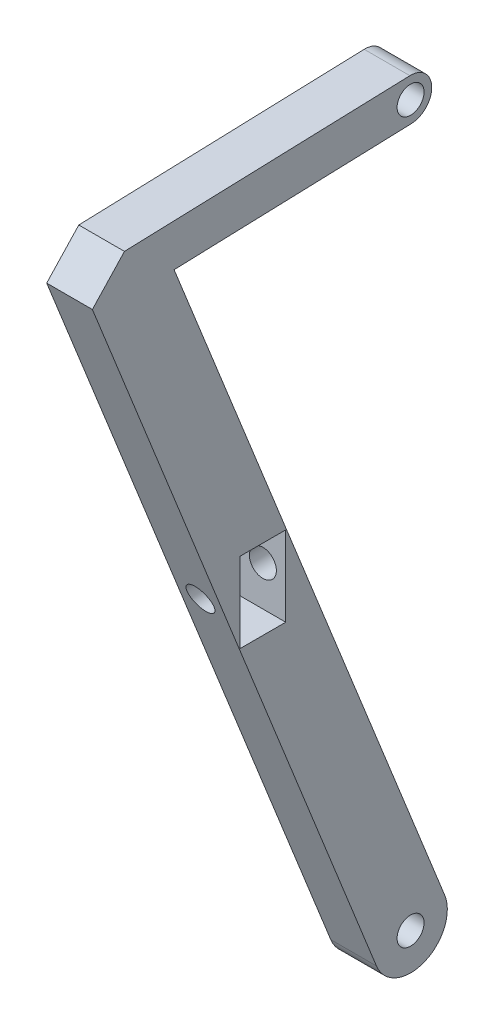
ISO-10303-21;
HEADER;
FILE_DESCRIPTION(('STEP AP214'),'2;1');
FILE_NAME('part.step','',(''),(''),'','','');
FILE_SCHEMA(('AUTOMOTIVE_DESIGN { 1 0 10303 214 1 1 1 1 }'));
ENDSEC;
DATA;
#1=APPLICATION_CONTEXT('core data for automotive mechanical design processes');
#2=APPLICATION_PROTOCOL_DEFINITION('international standard','automotive_design',2000,#1);
#3=PRODUCT_CONTEXT('',#1,'mechanical');
#4=PRODUCT('Part','Part','',(#3));
#5=PRODUCT_RELATED_PRODUCT_CATEGORY('part','',(#4));
#6=PRODUCT_DEFINITION_FORMATION('','',#4);
#7=PRODUCT_DEFINITION_CONTEXT('part definition',#1,'design');
#8=PRODUCT_DEFINITION('design','',#6,#7);
#9=PRODUCT_DEFINITION_SHAPE('','',#8);
#10=(LENGTH_UNIT() NAMED_UNIT(*) SI_UNIT(.MILLI.,.METRE.));
#11=(NAMED_UNIT(*) PLANE_ANGLE_UNIT() SI_UNIT($,.RADIAN.));
#12=(NAMED_UNIT(*) SI_UNIT($,.STERADIAN.) SOLID_ANGLE_UNIT());
#13=UNCERTAINTY_MEASURE_WITH_UNIT(LENGTH_MEASURE(1.E-05),#10,'distance_accuracy_value','');
#14=(GEOMETRIC_REPRESENTATION_CONTEXT(3) GLOBAL_UNCERTAINTY_ASSIGNED_CONTEXT((#13)) GLOBAL_UNIT_ASSIGNED_CONTEXT((#10,
#11,#12)) REPRESENTATION_CONTEXT('',''));
#15=CARTESIAN_POINT('',(0.,0.,0.));
#16=DIRECTION('',(0.,0.,1.));
#17=DIRECTION('',(1.,0.,0.));
#18=AXIS2_PLACEMENT_3D('',#15,#16,#17);
#19=CARTESIAN_POINT('',(2.54,1.51629735101285,-3.79292461153072));
#20=DIRECTION('',(0.,-0.371206534410744,0.928550326482504));
#21=DIRECTION('',(0.,-0.928550326482504,-0.371206534410744));
#22=AXIS2_PLACEMENT_3D('',#19,#20,#21);
#23=PLANE('',#22);
#24=CARTESIAN_POINT('',(0.,41.075962298,12.021841382952));
#25=DIRECTION('',(0.,-0.371206534410744,0.928550326482504));
#26=DIRECTION('',(0.,0.928550326482504,0.371206534410744));
#27=AXIS2_PLACEMENT_3D('',#24,#25,#26);
#28=ELLIPSE('',#27,1.61542132636175,1.5);
#29=CARTESIAN_POINT('',(0.,42.575962298,12.6214963351239));
#30=VERTEX_POINT('',#29);
#31=EDGE_CURVE('E159',#30,#30,#28,.T.);
#32=ORIENTED_EDGE('',*,*,#31,.T.);
#33=EDGE_LOOP('',(#32));
#34=FACE_BOUND('',#33,.T.);
#35=DIRECTION('',(0.,0.928550326482504,0.371206534410744));
#36=VECTOR('',#35,1.);
#37=CARTESIAN_POINT('',(-2.54,1.51629735101285,-3.79292461153072));
#38=LINE('',#37,#36);
#39=CARTESIAN_POINT('',(-2.54,1.51629735101285,-3.79292461153072));
#40=VERTEX_POINT('',#39);
#41=CARTESIAN_POINT('',(-2.54,76.7745550239051,26.2930666587244));
#42=VERTEX_POINT('',#41);
#43=EDGE_CURVE('E209',#40,#42,#38,.T.);
#44=ORIENTED_EDGE('',*,*,#43,.T.);
#45=DIRECTION('',(-1.,0.,0.));
#46=VECTOR('',#45,1.);
#47=CARTESIAN_POINT('',(2.54,76.7745550239051,26.2930666587244));
#48=LINE('',#47,#46);
#49=CARTESIAN_POINT('',(2.54,76.7745550239051,26.2930666587244));
#50=VERTEX_POINT('',#49);
#51=EDGE_CURVE('E11',#50,#42,#48,.T.);
#52=ORIENTED_EDGE('',*,*,#51,.F.);
#53=DIRECTION('',(0.,0.928550326482504,0.371206534410744));
#54=VECTOR('',#53,1.);
#55=CARTESIAN_POINT('',(2.54,1.51629735101285,-3.79292461153072));
#56=LINE('',#55,#54);
#57=CARTESIAN_POINT('',(2.54,1.51629735101285,-3.79292461153072));
#58=VERTEX_POINT('',#57);
#59=EDGE_CURVE('E178',#58,#50,#56,.T.);
#60=ORIENTED_EDGE('',*,*,#59,.F.);
#61=DIRECTION('',(-1.,0.,0.));
#62=VECTOR('',#61,1.);
#63=CARTESIAN_POINT('',(2.54,1.51629735101285,-3.79292461153072));
#64=LINE('',#63,#62);
#65=EDGE_CURVE('E206',#58,#40,#64,.T.);
#66=ORIENTED_EDGE('',*,*,#65,.T.);
#67=EDGE_LOOP('',(#44,#52,#60,#66));
#68=FACE_BOUND('',#67,.T.);
#69=ADVANCED_FACE('F39',(#34,#68),#23,.F.);
#70=CARTESIAN_POINT('',(2.54,77.5603537697931,2.56898588881145));
#71=DIRECTION('',(0.,0.999451903899437,0.0331042563999157));
#72=DIRECTION('',(0.,-0.0331042563999157,0.999451903899437));
#73=AXIS2_PLACEMENT_3D('',#70,#71,#72);
#74=PLANE('',#73);
#75=DIRECTION('',(0.,0.0331042563999157,-0.999451903899437));
#76=VECTOR('',#75,1.);
#77=CARTESIAN_POINT('',(-2.54,77.5603537697931,2.56898588881145));
#78=LINE('',#77,#76);
#79=CARTESIAN_POINT('',(-2.54,77.6454447753924,0.));
#80=VERTEX_POINT('',#79);
#81=EDGE_CURVE('E212',#42,#80,#78,.T.);
#82=ORIENTED_EDGE('',*,*,#81,.T.);
#83=DIRECTION('',(-1.,0.,0.));
#84=VECTOR('',#83,1.);
#85=CARTESIAN_POINT('',(2.54,77.6454447753924,0.));
#86=LINE('',#85,#84);
#87=CARTESIAN_POINT('',(2.54,77.6454447753924,0.));
#88=VERTEX_POINT('',#87);
#89=EDGE_CURVE('E48',#88,#80,#86,.T.);
#90=ORIENTED_EDGE('',*,*,#89,.F.);
#91=DIRECTION('',(0.,0.0331042563999157,-0.999451903899437));
#92=VECTOR('',#91,1.);
#93=CARTESIAN_POINT('',(2.54,77.5603537697931,2.56898588881145));
#94=LINE('',#93,#92);
#95=EDGE_CURVE('E182',#50,#88,#94,.T.);
#96=ORIENTED_EDGE('',*,*,#95,.F.);
#97=ORIENTED_EDGE('',*,*,#51,.T.);
#98=EDGE_LOOP('',(#82,#90,#96,#97));
#99=FACE_BOUND('',#98,.T.);
#100=ADVANCED_FACE('F275',(#99),#74,.F.);
#101=CARTESIAN_POINT('',(2.54,0.,0.));
#102=DIRECTION('',(0.,0.,1.));
#103=DIRECTION('',(0.,-1.,0.));
#104=AXIS2_PLACEMENT_3D('',#101,#102,#103);
#105=PLANE('',#104);
#106=DIRECTION('',(0.,1.,0.));
#107=VECTOR('',#106,1.);
#108=CARTESIAN_POINT('',(-2.54,0.,0.));
#109=LINE('',#108,#107);
#110=CARTESIAN_POINT('',(-2.54,77.6572407742781,0.));
#111=VERTEX_POINT('',#110);
#112=EDGE_CURVE('E214',#80,#111,#109,.T.);
#113=ORIENTED_EDGE('',*,*,#112,.T.);
#114=DIRECTION('',(-1.,0.,0.));
#115=VECTOR('',#114,1.);
#116=CARTESIAN_POINT('',(2.54,77.6572407742781,0.));
#117=LINE('',#116,#115);
#118=CARTESIAN_POINT('',(2.54,77.6572407742781,0.));
#119=VERTEX_POINT('',#118);
#120=EDGE_CURVE('E247',#119,#111,#117,.T.);
#121=ORIENTED_EDGE('',*,*,#120,.F.);
#122=DIRECTION('',(0.,1.,0.));
#123=VECTOR('',#122,1.);
#124=CARTESIAN_POINT('',(2.54,0.,0.));
#125=LINE('',#124,#123);
#126=EDGE_CURVE('E184',#88,#119,#125,.T.);
#127=ORIENTED_EDGE('',*,*,#126,.F.);
#128=ORIENTED_EDGE('',*,*,#89,.T.);
#129=EDGE_LOOP('',(#113,#121,#127,#128));
#130=FACE_BOUND('',#129,.T.);
#131=ADVANCED_FACE('F255',(#130),#105,.F.);
#132=CARTESIAN_POINT('',(2.54,76.5854986423084,-9.05979611210233));
#133=DIRECTION('',(0.,0.993075561150244,-0.117477358865984));
#134=DIRECTION('',(0.,0.117477358865984,0.993075561150244));
#135=AXIS2_PLACEMENT_3D('',#132,#133,#134);
#136=PLANE('',#135);
#137=DIRECTION('',(0.,-0.117477358865984,-0.993075561150245));
#138=VECTOR('',#137,1.);
#139=CARTESIAN_POINT('',(-2.54,76.5854986423084,-9.05979611210233));
#140=LINE('',#139,#138);
#141=CARTESIAN_POINT('',(-2.54,77.6480251131364,-0.0779030780741915));
#142=VERTEX_POINT('',#141);
#143=EDGE_CURVE('E216',#111,#142,#140,.T.);
#144=ORIENTED_EDGE('',*,*,#143,.T.);
#145=DIRECTION('',(-1.,0.,0.));
#146=VECTOR('',#145,1.);
#147=CARTESIAN_POINT('',(2.54,77.6480251131364,-0.0779030780741915));
#148=LINE('',#147,#146);
#149=CARTESIAN_POINT('',(2.54,77.6480251131364,-0.0779030780741915));
#150=VERTEX_POINT('',#149);
#151=EDGE_CURVE('E245',#150,#142,#148,.T.);
#152=ORIENTED_EDGE('',*,*,#151,.F.);
#153=DIRECTION('',(0.,-0.117477358865984,-0.993075561150245));
#154=VECTOR('',#153,1.);
#155=CARTESIAN_POINT('',(2.54,76.5854986423084,-9.05979611210233));
#156=LINE('',#155,#154);
#157=EDGE_CURVE('E186',#119,#150,#156,.T.);
#158=ORIENTED_EDGE('',*,*,#157,.F.);
#159=ORIENTED_EDGE('',*,*,#120,.T.);
#160=EDGE_LOOP('',(#144,#152,#158,#159));
#161=FACE_BOUND('',#160,.T.);
#162=ADVANCED_FACE('F265',(#161),#136,.F.);
#163=CARTESIAN_POINT('',(2.54,80.,0.));
#164=DIRECTION('',(-1.,0.,0.));
#165=DIRECTION('',(0.,0.,1.));
#166=AXIS2_PLACEMENT_3D('',#163,#164,#165);
#167=CYLINDRICAL_SURFACE('',#166,2.35326470207046);
#168=CARTESIAN_POINT('',(-2.54,80.,0.));
#169=DIRECTION('',(1.,0.,0.));
#170=DIRECTION('',(0.,0.,-1.));
#171=AXIS2_PLACEMENT_3D('',#168,#169,#170);
#172=CIRCLE('',#171,2.35326470207046);
#173=CARTESIAN_POINT('',(-2.54,82.3519748868637,0.0779030780742322));
#174=VERTEX_POINT('',#173);
#175=EDGE_CURVE('E219',#174,#142,#172,.F.);
#176=ORIENTED_EDGE('',*,*,#175,.F.);
#177=DIRECTION('',(-1.,0.,0.));
#178=VECTOR('',#177,1.);
#179=CARTESIAN_POINT('',(2.54,82.3519748868637,0.0779030780742322));
#180=LINE('',#179,#178);
#181=CARTESIAN_POINT('',(2.54,82.3519748868637,0.0779030780742322));
#182=VERTEX_POINT('',#181);
#183=EDGE_CURVE('E243',#182,#174,#180,.T.);
#184=ORIENTED_EDGE('',*,*,#183,.F.);
#185=CARTESIAN_POINT('',(2.54,80.,0.));
#186=DIRECTION('',(1.,0.,0.));
#187=DIRECTION('',(0.,0.,-1.));
#188=AXIS2_PLACEMENT_3D('',#185,#186,#187);
#189=CIRCLE('',#188,2.35326470207046);
#190=EDGE_CURVE('E188',#182,#150,#189,.F.);
#191=ORIENTED_EDGE('',*,*,#190,.T.);
#192=ORIENTED_EDGE('',*,*,#151,.T.);
#193=EDGE_LOOP('',(#176,#184,#191,#192));
#194=FACE_BOUND('',#193,.T.);
#195=ADVANCED_FACE('F292',(#194),#167,.T.);
#196=CARTESIAN_POINT('',(2.54,82.2643035435204,2.72479204495989));
#197=DIRECTION('',(0.,0.999451903899437,0.0331042563999158));
#198=DIRECTION('',(0.,-0.0331042563999158,0.999451903899437));
#199=AXIS2_PLACEMENT_3D('',#196,#197,#198);
#200=PLANE('',#199);
#201=DIRECTION('',(0.,0.0331042563999158,-0.999451903899437));
#202=VECTOR('',#201,1.);
#203=CARTESIAN_POINT('',(-2.54,82.2643035435204,2.72479204495989));
#204=LINE('',#203,#202);
#205=CARTESIAN_POINT('',(-2.54,81.3009147461663,31.8105010268816));
#206=VERTEX_POINT('',#205);
#207=EDGE_CURVE('E222',#206,#174,#204,.T.);
#208=ORIENTED_EDGE('',*,*,#207,.F.);
#209=DIRECTION('',(-1.,0.,0.));
#210=VECTOR('',#209,1.);
#211=CARTESIAN_POINT('',(2.54,81.3009147461663,31.8105010268816));
#212=LINE('',#211,#210);
#213=CARTESIAN_POINT('',(2.54,81.3009147461663,31.8105010268816));
#214=VERTEX_POINT('',#213);
#215=EDGE_CURVE('E241',#214,#206,#212,.T.);
#216=ORIENTED_EDGE('',*,*,#215,.F.);
#217=DIRECTION('',(0.,0.0331042563999158,-0.999451903899437));
#218=VECTOR('',#217,1.);
#219=CARTESIAN_POINT('',(2.54,82.2643035435204,2.72479204495989));
#220=LINE('',#219,#218);
#221=EDGE_CURVE('E191',#214,#182,#220,.T.);
#222=ORIENTED_EDGE('',*,*,#221,.T.);
#223=ORIENTED_EDGE('',*,*,#183,.T.);
#224=EDGE_LOOP('',(#208,#216,#222,#223));
#225=FACE_BOUND('',#224,.T.);
#226=ADVANCED_FACE('F290',(#225),#200,.T.);
#227=CARTESIAN_POINT('',(2.54,53.8590029402488,57.5101901545011));
#228=DIRECTION('',(0.,0.683557360271013,0.729896797649725));
#229=DIRECTION('',(0.,-0.729896797649725,0.683557360271013));
#230=AXIS2_PLACEMENT_3D('',#227,#228,#229);
#231=PLANE('',#230);
#232=DIRECTION('',(0.,0.729896797649725,-0.683557360271013));
#233=VECTOR('',#232,1.);
#234=CARTESIAN_POINT('',(-2.54,53.8590029402488,57.5101901545011));
#235=LINE('',#234,#233);
#236=CARTESIAN_POINT('',(-2.54,77.4916464643599,35.3779277914051));
#237=VERTEX_POINT('',#236);
#238=EDGE_CURVE('E225',#237,#206,#235,.T.);
#239=ORIENTED_EDGE('',*,*,#238,.F.);
#240=DIRECTION('',(-1.,0.,0.));
#241=VECTOR('',#240,1.);
#242=CARTESIAN_POINT('',(2.54,77.4916464643599,35.3779277914051));
#243=LINE('',#242,#241);
#244=CARTESIAN_POINT('',(2.54,77.4916464643599,35.3779277914051));
#245=VERTEX_POINT('',#244);
#246=EDGE_CURVE('E239',#245,#237,#243,.T.);
#247=ORIENTED_EDGE('',*,*,#246,.F.);
#248=DIRECTION('',(0.,0.729896797649725,-0.683557360271013));
#249=VECTOR('',#248,1.);
#250=CARTESIAN_POINT('',(2.54,53.8590029402488,57.5101901545011));
#251=LINE('',#250,#249);
#252=EDGE_CURVE('E194',#245,#214,#251,.T.);
#253=ORIENTED_EDGE('',*,*,#252,.T.);
#254=ORIENTED_EDGE('',*,*,#215,.T.);
#255=EDGE_LOOP('',(#239,#247,#253,#254));
#256=FACE_BOUND('',#255,.T.);
#257=ADVANCED_FACE('F287',(#256),#231,.T.);
#258=CARTESIAN_POINT('',(2.54,-1.51629735101285,3.79292461153072));
#259=DIRECTION('',(0.,-0.371206534410744,0.928550326482504));
#260=DIRECTION('',(0.,-0.928550326482504,-0.371206534410744));
#261=AXIS2_PLACEMENT_3D('',#258,#259,#260);
#262=PLANE('',#261);
#263=CARTESIAN_POINT('',(0.,41.075962298,20.8200308933468));
#264=DIRECTION('',(0.,-0.371206534410744,0.928550326482504));
#265=DIRECTION('',(0.,0.928550326482504,0.371206534410744));
#266=AXIS2_PLACEMENT_3D('',#263,#264,#265);
#267=ELLIPSE('',#266,1.61542132636175,1.5);
#268=CARTESIAN_POINT('',(0.,42.575962298,21.4196858455188));
#269=VERTEX_POINT('',#268);
#270=EDGE_CURVE('E452',#269,#269,#267,.T.);
#271=ORIENTED_EDGE('',*,*,#270,.F.);
#272=EDGE_LOOP('',(#271));
#273=FACE_BOUND('',#272,.T.);
#274=DIRECTION('',(0.,0.928550326482504,0.371206534410744));
#275=VECTOR('',#274,1.);
#276=CARTESIAN_POINT('',(-2.54,-1.51629735101285,3.79292461153072));
#277=LINE('',#276,#275);
#278=CARTESIAN_POINT('',(-2.54,-1.51629735101285,3.79292461153072));
#279=VERTEX_POINT('',#278);
#280=EDGE_CURVE('E228',#279,#237,#277,.T.);
#281=ORIENTED_EDGE('',*,*,#280,.F.);
#282=DIRECTION('',(-1.,0.,0.));
#283=VECTOR('',#282,1.);
#284=CARTESIAN_POINT('',(2.54,-1.51629735101285,3.79292461153072));
#285=LINE('',#284,#283);
#286=CARTESIAN_POINT('',(2.54,-1.51629735101285,3.79292461153072));
#287=VERTEX_POINT('',#286);
#288=EDGE_CURVE('E237',#287,#279,#285,.T.);
#289=ORIENTED_EDGE('',*,*,#288,.F.);
#290=DIRECTION('',(0.,0.928550326482504,0.371206534410744));
#291=VECTOR('',#290,1.);
#292=CARTESIAN_POINT('',(2.54,-1.51629735101285,3.79292461153072));
#293=LINE('',#292,#291);
#294=EDGE_CURVE('E197',#287,#245,#293,.T.);
#295=ORIENTED_EDGE('',*,*,#294,.T.);
#296=ORIENTED_EDGE('',*,*,#246,.T.);
#297=EDGE_LOOP('',(#281,#289,#295,#296));
#298=FACE_BOUND('',#297,.T.);
#299=ADVANCED_FACE('F283',(#273,#298),#262,.T.);
#300=CARTESIAN_POINT('',(2.54,0.,0.));
#301=DIRECTION('',(-1.,0.,0.));
#302=DIRECTION('',(0.,0.,1.));
#303=AXIS2_PLACEMENT_3D('',#300,#301,#302);
#304=CYLINDRICAL_SURFACE('',#303,4.08478087116605);
#305=CARTESIAN_POINT('',(-2.54,0.,0.));
#306=DIRECTION('',(1.,0.,0.));
#307=DIRECTION('',(0.,0.,-1.));
#308=AXIS2_PLACEMENT_3D('',#305,#306,#307);
#309=CIRCLE('',#308,4.08478087116605);
#310=EDGE_CURVE('E231',#40,#279,#309,.F.);
#311=ORIENTED_EDGE('',*,*,#310,.F.);
#312=ORIENTED_EDGE('',*,*,#65,.F.);
#313=CARTESIAN_POINT('',(2.54,0.,0.));
#314=DIRECTION('',(1.,0.,0.));
#315=DIRECTION('',(0.,0.,-1.));
#316=AXIS2_PLACEMENT_3D('',#313,#314,#315);
#317=CIRCLE('',#316,4.08478087116605);
#318=EDGE_CURVE('E200',#58,#287,#317,.F.);
#319=ORIENTED_EDGE('',*,*,#318,.T.);
#320=ORIENTED_EDGE('',*,*,#288,.T.);
#321=EDGE_LOOP('',(#311,#312,#319,#320));
#322=FACE_BOUND('',#321,.T.);
#323=ADVANCED_FACE('F279',(#322),#304,.T.);
#324=CARTESIAN_POINT('',(2.54,80.,0.));
#325=DIRECTION('',(-1.,0.,0.));
#326=DIRECTION('',(0.,0.,1.));
#327=AXIS2_PLACEMENT_3D('',#324,#325,#326);
#328=CYLINDRICAL_SURFACE('',#327,1.5);
#329=CARTESIAN_POINT('',(2.54,80.,0.));
#330=DIRECTION('',(1.,0.,0.));
#331=DIRECTION('',(0.,0.,-1.));
#332=AXIS2_PLACEMENT_3D('',#329,#330,#331);
#333=CIRCLE('',#332,1.5);
#334=CARTESIAN_POINT('',(2.54,80.,-1.49999999999998));
#335=VERTEX_POINT('',#334);
#336=EDGE_CURVE('E175',#335,#335,#333,.T.);
#337=ORIENTED_EDGE('',*,*,#336,.T.);
#338=EDGE_LOOP('',(#337));
#339=FACE_BOUND('',#338,.T.);
#340=CARTESIAN_POINT('',(-2.54,80.,0.));
#341=DIRECTION('',(1.,0.,0.));
#342=DIRECTION('',(0.,0.,-1.));
#343=AXIS2_PLACEMENT_3D('',#340,#341,#342);
#344=CIRCLE('',#343,1.5);
#345=CARTESIAN_POINT('',(-2.54,80.,-1.49999999999998));
#346=VERTEX_POINT('',#345);
#347=EDGE_CURVE('E171',#346,#346,#344,.T.);
#348=ORIENTED_EDGE('',*,*,#347,.F.);
#349=EDGE_LOOP('',(#348));
#350=FACE_BOUND('',#349,.T.);
#351=ADVANCED_FACE('F41',(#339,#350),#328,.F.);
#352=CARTESIAN_POINT('',(2.54,0.,0.));
#353=DIRECTION('',(-1.,0.,0.));
#354=DIRECTION('',(0.,0.,1.));
#355=AXIS2_PLACEMENT_3D('',#352,#353,#354);
#356=CYLINDRICAL_SURFACE('',#355,1.5);
#357=CARTESIAN_POINT('',(2.54,0.,0.));
#358=DIRECTION('',(1.,0.,0.));
#359=DIRECTION('',(0.,0.,-1.));
#360=AXIS2_PLACEMENT_3D('',#357,#358,#359);
#361=CIRCLE('',#360,1.5);
#362=CARTESIAN_POINT('',(2.54,0.,-1.5));
#363=VERTEX_POINT('',#362);
#364=EDGE_CURVE('E203',#363,#363,#361,.T.);
#365=ORIENTED_EDGE('',*,*,#364,.T.);
#366=EDGE_LOOP('',(#365));
#367=FACE_BOUND('',#366,.T.);
#368=CARTESIAN_POINT('',(-2.54,0.,0.));
#369=DIRECTION('',(1.,0.,0.));
#370=DIRECTION('',(0.,0.,-1.));
#371=AXIS2_PLACEMENT_3D('',#368,#369,#370);
#372=CIRCLE('',#371,1.5);
#373=CARTESIAN_POINT('',(-2.54,0.,-1.5));
#374=VERTEX_POINT('',#373);
#375=EDGE_CURVE('E179',#374,#374,#372,.T.);
#376=ORIENTED_EDGE('',*,*,#375,.F.);
#377=EDGE_LOOP('',(#376));
#378=FACE_BOUND('',#377,.T.);
#379=ADVANCED_FACE('F366',(#367,#378),#356,.F.);
#380=CARTESIAN_POINT('',(2.54,0.,0.));
#381=DIRECTION('',(1.,0.,0.));
#382=DIRECTION('',(0.,0.,-1.));
#383=AXIS2_PLACEMENT_3D('',#380,#381,#382);
#384=PLANE('',#383);
#385=DIRECTION('',(0.,-1.,0.));
#386=VECTOR('',#385,1.);
#387=CARTESIAN_POINT('',(2.54,36.630962298,18.9609361381494));
#388=LINE('',#387,#386);
#389=CARTESIAN_POINT('',(2.54,45.520962298,18.9609361381494));
#390=VERTEX_POINT('',#389);
#391=CARTESIAN_POINT('',(2.54,36.630962298,18.9609361381494));
#392=VERTEX_POINT('',#391);
#393=EDGE_CURVE('E55',#390,#392,#388,.T.);
#394=ORIENTED_EDGE('',*,*,#393,.F.);
#395=DIRECTION('',(0.,0.,1.));
#396=VECTOR('',#395,1.);
#397=CARTESIAN_POINT('',(2.54,45.520962298,13.8809361381494));
#398=LINE('',#397,#396);
#399=CARTESIAN_POINT('',(2.54,45.520962298,13.8809361381494));
#400=VERTEX_POINT('',#399);
#401=EDGE_CURVE('E153',#400,#390,#398,.T.);
#402=ORIENTED_EDGE('',*,*,#401,.F.);
#403=DIRECTION('',(0.,1.,0.));
#404=VECTOR('',#403,1.);
#405=CARTESIAN_POINT('',(2.54,36.630962298,13.8809361381494));
#406=LINE('',#405,#404);
#407=CARTESIAN_POINT('',(2.54,36.630962298,13.8809361381494));
#408=VERTEX_POINT('',#407);
#409=EDGE_CURVE('E156',#408,#400,#406,.T.);
#410=ORIENTED_EDGE('',*,*,#409,.F.);
#411=DIRECTION('',(0.,0.,-1.));
#412=VECTOR('',#411,1.);
#413=CARTESIAN_POINT('',(2.54,36.630962298,13.8809361381494));
#414=LINE('',#413,#412);
#415=EDGE_CURVE('E165',#392,#408,#414,.T.);
#416=ORIENTED_EDGE('',*,*,#415,.F.);
#417=EDGE_LOOP('',(#394,#402,#410,#416));
#418=FACE_BOUND('',#417,.T.);
#419=ORIENTED_EDGE('',*,*,#336,.F.);
#420=EDGE_LOOP('',(#419));
#421=FACE_BOUND('',#420,.T.);
#422=ORIENTED_EDGE('',*,*,#59,.T.);
#423=ORIENTED_EDGE('',*,*,#95,.T.);
#424=ORIENTED_EDGE('',*,*,#126,.T.);
#425=ORIENTED_EDGE('',*,*,#157,.T.);
#426=ORIENTED_EDGE('',*,*,#190,.F.);
#427=ORIENTED_EDGE('',*,*,#221,.F.);
#428=ORIENTED_EDGE('',*,*,#252,.F.);
#429=ORIENTED_EDGE('',*,*,#294,.F.);
#430=ORIENTED_EDGE('',*,*,#318,.F.);
#431=EDGE_LOOP('',(#422,#423,#424,#425,#426,#427,#428,#429,#430));
#432=FACE_BOUND('',#431,.T.);
#433=ORIENTED_EDGE('',*,*,#364,.F.);
#434=EDGE_LOOP('',(#433));
#435=FACE_BOUND('',#434,.T.);
#436=ADVANCED_FACE('F269',(#418,#421,#432,#435),#384,.T.);
#437=CARTESIAN_POINT('',(-2.54,0.,0.));
#438=DIRECTION('',(1.,0.,0.));
#439=DIRECTION('',(0.,0.,-1.));
#440=AXIS2_PLACEMENT_3D('',#437,#438,#439);
#441=PLANE('',#440);
#442=DIRECTION('',(0.,0.,1.));
#443=VECTOR('',#442,1.);
#444=CARTESIAN_POINT('',(-2.54,45.520962298,13.8809361381494));
#445=LINE('',#444,#443);
#446=CARTESIAN_POINT('',(-2.54,45.520962298,13.8809361381494));
#447=VERTEX_POINT('',#446);
#448=CARTESIAN_POINT('',(-2.54,45.520962298,18.9609361381494));
#449=VERTEX_POINT('',#448);
#450=EDGE_CURVE('E143',#447,#449,#445,.T.);
#451=ORIENTED_EDGE('',*,*,#450,.T.);
#452=DIRECTION('',(0.,-1.,0.));
#453=VECTOR('',#452,1.);
#454=CARTESIAN_POINT('',(-2.54,36.630962298,18.9609361381494));
#455=LINE('',#454,#453);
#456=CARTESIAN_POINT('',(-2.54,36.630962298,18.9609361381494));
#457=VERTEX_POINT('',#456);
#458=EDGE_CURVE('E137',#449,#457,#455,.T.);
#459=ORIENTED_EDGE('',*,*,#458,.T.);
#460=DIRECTION('',(0.,0.,-1.));
#461=VECTOR('',#460,1.);
#462=CARTESIAN_POINT('',(-2.54,36.630962298,13.8809361381494));
#463=LINE('',#462,#461);
#464=CARTESIAN_POINT('',(-2.54,36.630962298,13.8809361381494));
#465=VERTEX_POINT('',#464);
#466=EDGE_CURVE('E146',#457,#465,#463,.T.);
#467=ORIENTED_EDGE('',*,*,#466,.T.);
#468=DIRECTION('',(0.,1.,0.));
#469=VECTOR('',#468,1.);
#470=CARTESIAN_POINT('',(-2.54,36.630962298,13.8809361381494));
#471=LINE('',#470,#469);
#472=EDGE_CURVE('E63',#465,#447,#471,.T.);
#473=ORIENTED_EDGE('',*,*,#472,.T.);
#474=EDGE_LOOP('',(#451,#459,#467,#473));
#475=FACE_BOUND('',#474,.T.);
#476=ORIENTED_EDGE('',*,*,#347,.T.);
#477=EDGE_LOOP('',(#476));
#478=FACE_BOUND('',#477,.T.);
#479=ORIENTED_EDGE('',*,*,#43,.F.);
#480=ORIENTED_EDGE('',*,*,#310,.T.);
#481=ORIENTED_EDGE('',*,*,#280,.T.);
#482=ORIENTED_EDGE('',*,*,#238,.T.);
#483=ORIENTED_EDGE('',*,*,#207,.T.);
#484=ORIENTED_EDGE('',*,*,#175,.T.);
#485=ORIENTED_EDGE('',*,*,#143,.F.);
#486=ORIENTED_EDGE('',*,*,#112,.F.);
#487=ORIENTED_EDGE('',*,*,#81,.F.);
#488=EDGE_LOOP('',(#479,#480,#481,#482,#483,#484,#485,#486,#487));
#489=FACE_BOUND('',#488,.T.);
#490=ORIENTED_EDGE('',*,*,#375,.T.);
#491=EDGE_LOOP('',(#490));
#492=FACE_BOUND('',#491,.T.);
#493=ADVANCED_FACE('F150',(#475,#478,#489,#492),#441,.F.);
#494=CARTESIAN_POINT('',(-2.54,36.630962298,18.9609361381494));
#495=DIRECTION('',(0.,0.,1.));
#496=DIRECTION('',(1.,0.,0.));
#497=AXIS2_PLACEMENT_3D('',#494,#495,#496);
#498=PLANE('',#497);
#499=CARTESIAN_POINT('',(0.,41.075962298,18.9609361381494));
#500=DIRECTION('',(0.,0.,1.));
#501=DIRECTION('',(1.,0.,0.));
#502=AXIS2_PLACEMENT_3D('',#499,#500,#501);
#503=CIRCLE('',#502,1.5);
#504=CARTESIAN_POINT('',(1.5,41.075962298,18.9609361381494));
#505=VERTEX_POINT('',#504);
#506=EDGE_CURVE('E455',#505,#505,#503,.T.);
#507=ORIENTED_EDGE('',*,*,#506,.T.);
#508=EDGE_LOOP('',(#507));
#509=FACE_BOUND('',#508,.T.);
#510=ORIENTED_EDGE('',*,*,#393,.T.);
#511=DIRECTION('',(1.,0.,0.));
#512=VECTOR('',#511,1.);
#513=CARTESIAN_POINT('',(-2.54,36.630962298,18.9609361381494));
#514=LINE('',#513,#512);
#515=EDGE_CURVE('E133',#457,#392,#514,.T.);
#516=ORIENTED_EDGE('',*,*,#515,.F.);
#517=ORIENTED_EDGE('',*,*,#458,.F.);
#518=DIRECTION('',(1.,0.,0.));
#519=VECTOR('',#518,1.);
#520=CARTESIAN_POINT('',(-2.54,45.520962298,18.9609361381494));
#521=LINE('',#520,#519);
#522=EDGE_CURVE('E169',#449,#390,#521,.T.);
#523=ORIENTED_EDGE('',*,*,#522,.T.);
#524=EDGE_LOOP('',(#510,#516,#517,#523));
#525=FACE_BOUND('',#524,.T.);
#526=ADVANCED_FACE('F135',(#509,#525),#498,.F.);
#527=CARTESIAN_POINT('',(-2.54,45.520962298,13.8809361381494));
#528=DIRECTION('',(0.,1.,0.));
#529=DIRECTION('',(0.,0.,1.));
#530=AXIS2_PLACEMENT_3D('',#527,#528,#529);
#531=PLANE('',#530);
#532=ORIENTED_EDGE('',*,*,#401,.T.);
#533=ORIENTED_EDGE('',*,*,#522,.F.);
#534=ORIENTED_EDGE('',*,*,#450,.F.);
#535=DIRECTION('',(1.,0.,0.));
#536=VECTOR('',#535,1.);
#537=CARTESIAN_POINT('',(-2.54,45.520962298,13.8809361381494));
#538=LINE('',#537,#536);
#539=EDGE_CURVE('E172',#447,#400,#538,.T.);
#540=ORIENTED_EDGE('',*,*,#539,.T.);
#541=EDGE_LOOP('',(#532,#533,#534,#540));
#542=FACE_BOUND('',#541,.T.);
#543=ADVANCED_FACE('F401',(#542),#531,.F.);
#544=CARTESIAN_POINT('',(-2.54,36.630962298,13.8809361381494));
#545=DIRECTION('',(0.,0.,-1.));
#546=DIRECTION('',(-1.,0.,0.));
#547=AXIS2_PLACEMENT_3D('',#544,#545,#546);
#548=PLANE('',#547);
#549=CARTESIAN_POINT('',(0.,41.075962298,13.8809361381494));
#550=DIRECTION('',(0.,0.,-1.));
#551=DIRECTION('',(-1.,0.,0.));
#552=AXIS2_PLACEMENT_3D('',#549,#550,#551);
#553=CIRCLE('',#552,1.5);
#554=CARTESIAN_POINT('',(-1.5,41.075962298,13.8809361381494));
#555=VERTEX_POINT('',#554);
#556=EDGE_CURVE('E43',#555,#555,#553,.T.);
#557=ORIENTED_EDGE('',*,*,#556,.T.);
#558=EDGE_LOOP('',(#557));
#559=FACE_BOUND('',#558,.T.);
#560=ORIENTED_EDGE('',*,*,#409,.T.);
#561=ORIENTED_EDGE('',*,*,#539,.F.);
#562=ORIENTED_EDGE('',*,*,#472,.F.);
#563=DIRECTION('',(1.,0.,0.));
#564=VECTOR('',#563,1.);
#565=CARTESIAN_POINT('',(-2.54,36.630962298,13.8809361381494));
#566=LINE('',#565,#564);
#567=EDGE_CURVE('E142',#465,#408,#566,.T.);
#568=ORIENTED_EDGE('',*,*,#567,.T.);
#569=EDGE_LOOP('',(#560,#561,#562,#568));
#570=FACE_BOUND('',#569,.T.);
#571=ADVANCED_FACE('F411',(#559,#570),#548,.F.);
#572=CARTESIAN_POINT('',(-2.54,36.630962298,13.8809361381494));
#573=DIRECTION('',(0.,-1.,0.));
#574=DIRECTION('',(0.,0.,-1.));
#575=AXIS2_PLACEMENT_3D('',#572,#573,#574);
#576=PLANE('',#575);
#577=ORIENTED_EDGE('',*,*,#415,.T.);
#578=ORIENTED_EDGE('',*,*,#567,.F.);
#579=ORIENTED_EDGE('',*,*,#466,.F.);
#580=ORIENTED_EDGE('',*,*,#515,.T.);
#581=EDGE_LOOP('',(#577,#578,#579,#580));
#582=FACE_BOUND('',#581,.T.);
#583=ADVANCED_FACE('F147',(#582),#576,.F.);
#584=CARTESIAN_POINT('',(0.,41.075962298,-4.08478087116605));
#585=DIRECTION('',(0.,0.,1.));
#586=DIRECTION('',(1.,0.,0.));
#587=AXIS2_PLACEMENT_3D('',#584,#585,#586);
#588=CYLINDRICAL_SURFACE('',#587,1.5);
#589=ORIENTED_EDGE('',*,*,#556,.F.);
#590=EDGE_LOOP('',(#589));
#591=FACE_BOUND('',#590,.T.);
#592=ORIENTED_EDGE('',*,*,#31,.F.);
#593=EDGE_LOOP('',(#592));
#594=FACE_BOUND('',#593,.T.);
#595=ADVANCED_FACE('F429',(#591,#594),#588,.F.);
#596=ORIENTED_EDGE('',*,*,#270,.T.);
#597=EDGE_LOOP('',(#596));
#598=FACE_BOUND('',#597,.T.);
#599=ORIENTED_EDGE('',*,*,#506,.F.);
#600=EDGE_LOOP('',(#599));
#601=FACE_BOUND('',#600,.T.);
#602=ADVANCED_FACE('F437',(#598,#601),#588,.F.);
#603=CLOSED_SHELL('',(#69,#100,#131,#162,#195,#226,#257,#299,#323,#351,#379,#436,#493,#526,#543,
#571,#583,#595,#602));
#604=MANIFOLD_SOLID_BREP('B2',#603);
#605=ADVANCED_BREP_SHAPE_REPRESENTATION('',(#18,#604),#14);
#606=SHAPE_DEFINITION_REPRESENTATION(#9,#605);
ENDSEC;
END-ISO-10303-21;
